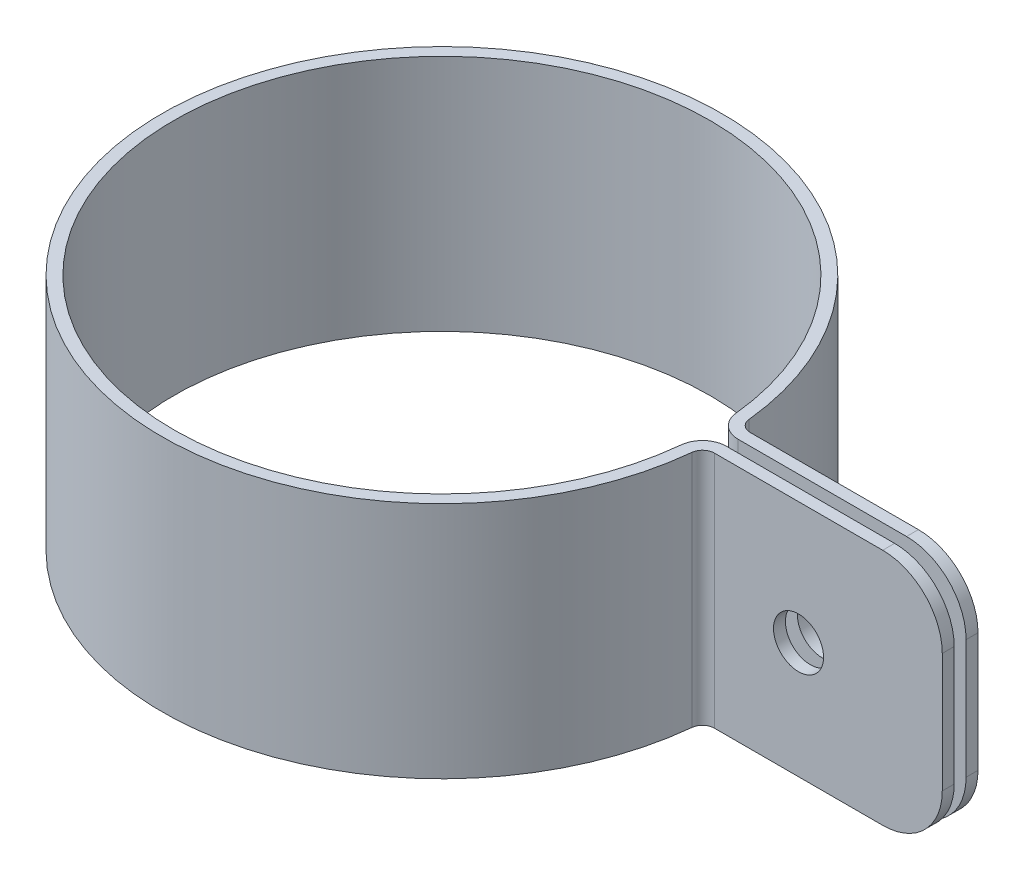
ISO-10303-21;
HEADER;
FILE_DESCRIPTION(('STEP AP214'),'2;1');
FILE_NAME('part.step','',(''),(''),'','','');
FILE_SCHEMA(('AUTOMOTIVE_DESIGN { 1 0 10303 214 1 1 1 1 }'));
ENDSEC;
DATA;
#1=APPLICATION_CONTEXT('core data for automotive mechanical design processes');
#2=APPLICATION_PROTOCOL_DEFINITION('international standard','automotive_design',2000,#1);
#3=PRODUCT_CONTEXT('',#1,'mechanical');
#4=PRODUCT('Part','Part','',(#3));
#5=PRODUCT_RELATED_PRODUCT_CATEGORY('part','',(#4));
#6=PRODUCT_DEFINITION_FORMATION('','',#4);
#7=PRODUCT_DEFINITION_CONTEXT('part definition',#1,'design');
#8=PRODUCT_DEFINITION('design','',#6,#7);
#9=PRODUCT_DEFINITION_SHAPE('','',#8);
#10=(LENGTH_UNIT() NAMED_UNIT(*) SI_UNIT(.MILLI.,.METRE.));
#11=(NAMED_UNIT(*) PLANE_ANGLE_UNIT() SI_UNIT($,.RADIAN.));
#12=(NAMED_UNIT(*) SI_UNIT($,.STERADIAN.) SOLID_ANGLE_UNIT());
#13=UNCERTAINTY_MEASURE_WITH_UNIT(LENGTH_MEASURE(1.E-05),#10,'distance_accuracy_value','');
#14=(GEOMETRIC_REPRESENTATION_CONTEXT(3) GLOBAL_UNCERTAINTY_ASSIGNED_CONTEXT((#13)) GLOBAL_UNIT_ASSIGNED_CONTEXT((#10,
#11,#12)) REPRESENTATION_CONTEXT('',''));
#15=CARTESIAN_POINT('',(0.,0.,0.));
#16=DIRECTION('',(0.,0.,1.));
#17=DIRECTION('',(1.,0.,0.));
#18=AXIS2_PLACEMENT_3D('',#15,#16,#17);
#19=CARTESIAN_POINT('',(43.5,20.,-0.5));
#20=DIRECTION('',(-1.,0.,0.));
#21=DIRECTION('',(0.,0.,1.));
#22=AXIS2_PLACEMENT_3D('',#19,#20,#21);
#23=PLANE('',#22);
#24=DIRECTION('',(0.,-1.,0.));
#25=VECTOR('',#24,1.);
#26=CARTESIAN_POINT('',(43.5,20.,-0.5));
#27=LINE('',#26,#25);
#28=CARTESIAN_POINT('',(43.5,15.,-0.5));
#29=VERTEX_POINT('',#28);
#30=CARTESIAN_POINT('',(43.5,5.,-0.5));
#31=VERTEX_POINT('',#30);
#32=EDGE_CURVE('E189',#29,#31,#27,.T.);
#33=ORIENTED_EDGE('',*,*,#32,.T.);
#34=DIRECTION('',(0.,0.,-1.));
#35=VECTOR('',#34,1.);
#36=CARTESIAN_POINT('',(43.5,5.,-0.5));
#37=LINE('',#36,#35);
#38=CARTESIAN_POINT('',(43.5,5.,-1.5));
#39=VERTEX_POINT('',#38);
#40=EDGE_CURVE('E234',#31,#39,#37,.T.);
#41=ORIENTED_EDGE('',*,*,#40,.T.);
#42=DIRECTION('',(0.,-1.,0.));
#43=VECTOR('',#42,1.);
#44=CARTESIAN_POINT('',(43.5,20.,-1.5));
#45=LINE('',#44,#43);
#46=CARTESIAN_POINT('',(43.5,15.,-1.5));
#47=VERTEX_POINT('',#46);
#48=EDGE_CURVE('E174',#47,#39,#45,.T.);
#49=ORIENTED_EDGE('',*,*,#48,.F.);
#50=DIRECTION('',(0.,0.,-1.));
#51=VECTOR('',#50,1.);
#52=CARTESIAN_POINT('',(43.5,15.,-0.5));
#53=LINE('',#52,#51);
#54=EDGE_CURVE('E232',#47,#29,#53,.F.);
#55=ORIENTED_EDGE('',*,*,#54,.T.);
#56=EDGE_LOOP('',(#33,#41,#49,#55));
#57=FACE_BOUND('',#56,.T.);
#58=ADVANCED_FACE('F36',(#57),#23,.F.);
#59=CARTESIAN_POINT('',(43.5,20.,-1.5));
#60=DIRECTION('',(0.,0.,1.));
#61=DIRECTION('',(1.,0.,0.));
#62=AXIS2_PLACEMENT_3D('',#59,#60,#61);
#63=PLANE('',#62);
#64=CARTESIAN_POINT('',(31.4360576069539,9.73770905349625,-1.5));
#65=DIRECTION('',(0.,0.,-1.));
#66=DIRECTION('',(-1.,0.,0.));
#67=AXIS2_PLACEMENT_3D('',#64,#65,#66);
#68=CIRCLE('',#67,2.09999999999999);
#69=CARTESIAN_POINT('',(29.336057606954,9.73770905349625,-1.5));
#70=VERTEX_POINT('',#69);
#71=EDGE_CURVE('E364',#70,#70,#68,.T.);
#72=ORIENTED_EDGE('',*,*,#71,.F.);
#73=EDGE_LOOP('',(#72));
#74=FACE_BOUND('',#73,.T.);
#75=ORIENTED_EDGE('',*,*,#48,.T.);
#76=CARTESIAN_POINT('',(38.5,5.,-1.5));
#77=DIRECTION('',(0.,0.,1.));
#78=DIRECTION('',(1.,0.,0.));
#79=AXIS2_PLACEMENT_3D('',#76,#77,#78);
#80=CIRCLE('',#79,5.);
#81=CARTESIAN_POINT('',(38.5,0.,-1.5));
#82=VERTEX_POINT('',#81);
#83=EDGE_CURVE('E239',#39,#82,#80,.F.);
#84=ORIENTED_EDGE('',*,*,#83,.T.);
#85=DIRECTION('',(-1.,0.,0.));
#86=VECTOR('',#85,1.);
#87=CARTESIAN_POINT('',(43.5,0.,-1.5));
#88=LINE('',#87,#86);
#89=CARTESIAN_POINT('',(24.3721152139079,0.,-1.5));
#90=VERTEX_POINT('',#89);
#91=EDGE_CURVE('E277',#82,#90,#88,.T.);
#92=ORIENTED_EDGE('',*,*,#91,.T.);
#93=DIRECTION('',(0.,1.,0.));
#94=VECTOR('',#93,1.);
#95=CARTESIAN_POINT('',(24.3721152139079,20.,-1.5));
#96=LINE('',#95,#94);
#97=CARTESIAN_POINT('',(24.3721152139079,20.,-1.5));
#98=VERTEX_POINT('',#97);
#99=EDGE_CURVE('E217',#90,#98,#96,.T.);
#100=ORIENTED_EDGE('',*,*,#99,.T.);
#101=DIRECTION('',(-1.,0.,0.));
#102=VECTOR('',#101,1.);
#103=CARTESIAN_POINT('',(43.5,20.,-1.5));
#104=LINE('',#103,#102);
#105=CARTESIAN_POINT('',(38.5,20.,-1.5));
#106=VERTEX_POINT('',#105);
#107=EDGE_CURVE('E180',#106,#98,#104,.T.);
#108=ORIENTED_EDGE('',*,*,#107,.F.);
#109=CARTESIAN_POINT('',(38.5,15.,-1.5));
#110=DIRECTION('',(0.,0.,1.));
#111=DIRECTION('',(1.,0.,0.));
#112=AXIS2_PLACEMENT_3D('',#109,#110,#111);
#113=CIRCLE('',#112,5.);
#114=EDGE_CURVE('E237',#106,#47,#113,.F.);
#115=ORIENTED_EDGE('',*,*,#114,.T.);
#116=EDGE_LOOP('',(#75,#84,#92,#100,#108,#115));
#117=FACE_BOUND('',#116,.T.);
#118=ADVANCED_FACE('F305',(#74,#117),#63,.F.);
#119=CARTESIAN_POINT('',(0.,20.,0.));
#120=DIRECTION('',(0.,-1.,0.));
#121=DIRECTION('',(0.,0.,-1.));
#122=AXIS2_PLACEMENT_3D('',#119,#120,#121);
#123=CYLINDRICAL_SURFACE('',#122,23.5);
#124=CARTESIAN_POINT('',(0.,20.,0.));
#125=DIRECTION('',(0.,1.,0.));
#126=DIRECTION('',(0.,0.,1.));
#127=AXIS2_PLACEMENT_3D('',#124,#125,#126);
#128=CIRCLE('',#127,23.5);
#129=CARTESIAN_POINT('',(23.3773350010953,20.,-2.39795918367347));
#130=VERTEX_POINT('',#129);
#131=CARTESIAN_POINT('',(23.3773350010953,20.,2.39795918367347));
#132=VERTEX_POINT('',#131);
#133=EDGE_CURVE('E183',#130,#132,#128,.T.);
#134=ORIENTED_EDGE('',*,*,#133,.F.);
#135=DIRECTION('',(0.,-1.,0.));
#136=VECTOR('',#135,1.);
#137=CARTESIAN_POINT('',(23.3773350010953,20.,-2.39795918367347));
#138=LINE('',#137,#136);
#139=CARTESIAN_POINT('',(23.3773350010953,0.,-2.39795918367347));
#140=VERTEX_POINT('',#139);
#141=EDGE_CURVE('E214',#130,#140,#138,.T.);
#142=ORIENTED_EDGE('',*,*,#141,.T.);
#143=CARTESIAN_POINT('',(0.,0.,0.));
#144=DIRECTION('',(0.,1.,0.));
#145=DIRECTION('',(0.,0.,1.));
#146=AXIS2_PLACEMENT_3D('',#143,#144,#145);
#147=CIRCLE('',#146,23.5);
#148=CARTESIAN_POINT('',(23.3773350010953,0.,2.39795918367347));
#149=VERTEX_POINT('',#148);
#150=EDGE_CURVE('E279',#140,#149,#147,.T.);
#151=ORIENTED_EDGE('',*,*,#150,.T.);
#152=DIRECTION('',(0.,-1.,0.));
#153=VECTOR('',#152,1.);
#154=CARTESIAN_POINT('',(23.3773350010953,20.,2.39795918367347));
#155=LINE('',#154,#153);
#156=EDGE_CURVE('E212',#149,#132,#155,.F.);
#157=ORIENTED_EDGE('',*,*,#156,.T.);
#158=EDGE_LOOP('',(#134,#142,#151,#157));
#159=FACE_BOUND('',#158,.T.);
#160=ADVANCED_FACE('F311',(#159),#123,.T.);
#161=CARTESIAN_POINT('',(43.5,20.,1.5));
#162=DIRECTION('',(0.,0.,-1.));
#163=DIRECTION('',(-1.,0.,0.));
#164=AXIS2_PLACEMENT_3D('',#161,#162,#163);
#165=PLANE('',#164);
#166=CARTESIAN_POINT('',(31.4360576069539,9.73770905349625,1.5));
#167=DIRECTION('',(0.,0.,-1.));
#168=DIRECTION('',(-1.,0.,0.));
#169=AXIS2_PLACEMENT_3D('',#166,#167,#168);
#170=CIRCLE('',#169,2.09999999999999);
#171=CARTESIAN_POINT('',(29.336057606954,9.73770905349625,1.5));
#172=VERTEX_POINT('',#171);
#173=EDGE_CURVE('E280',#172,#172,#170,.T.);
#174=ORIENTED_EDGE('',*,*,#173,.T.);
#175=EDGE_LOOP('',(#174));
#176=FACE_BOUND('',#175,.T.);
#177=DIRECTION('',(1.,0.,0.));
#178=VECTOR('',#177,1.);
#179=CARTESIAN_POINT('',(43.5,0.,1.5));
#180=LINE('',#179,#178);
#181=CARTESIAN_POINT('',(24.3721152139079,0.,1.5));
#182=VERTEX_POINT('',#181);
#183=CARTESIAN_POINT('',(38.5,0.,1.5));
#184=VERTEX_POINT('',#183);
#185=EDGE_CURVE('E283',#182,#184,#180,.T.);
#186=ORIENTED_EDGE('',*,*,#185,.T.);
#187=CARTESIAN_POINT('',(38.5,5.,1.5));
#188=DIRECTION('',(0.,0.,-1.));
#189=DIRECTION('',(-1.,0.,0.));
#190=AXIS2_PLACEMENT_3D('',#187,#188,#189);
#191=CIRCLE('',#190,5.);
#192=CARTESIAN_POINT('',(43.5,5.,1.5));
#193=VERTEX_POINT('',#192);
#194=EDGE_CURVE('E257',#184,#193,#191,.F.);
#195=ORIENTED_EDGE('',*,*,#194,.T.);
#196=DIRECTION('',(0.,-1.,0.));
#197=VECTOR('',#196,1.);
#198=CARTESIAN_POINT('',(43.5,20.,1.5));
#199=LINE('',#198,#197);
#200=CARTESIAN_POINT('',(43.5,15.,1.5));
#201=VERTEX_POINT('',#200);
#202=EDGE_CURVE('E195',#201,#193,#199,.T.);
#203=ORIENTED_EDGE('',*,*,#202,.F.);
#204=CARTESIAN_POINT('',(38.5,15.,1.5));
#205=DIRECTION('',(0.,0.,-1.));
#206=DIRECTION('',(-1.,0.,0.));
#207=AXIS2_PLACEMENT_3D('',#204,#205,#206);
#208=CIRCLE('',#207,5.);
#209=CARTESIAN_POINT('',(38.5,20.,1.5));
#210=VERTEX_POINT('',#209);
#211=EDGE_CURVE('E52',#201,#210,#208,.F.);
#212=ORIENTED_EDGE('',*,*,#211,.T.);
#213=DIRECTION('',(1.,0.,0.));
#214=VECTOR('',#213,1.);
#215=CARTESIAN_POINT('',(43.5,20.,1.5));
#216=LINE('',#215,#214);
#217=CARTESIAN_POINT('',(24.3721152139079,20.,1.5));
#218=VERTEX_POINT('',#217);
#219=EDGE_CURVE('E263',#218,#210,#216,.T.);
#220=ORIENTED_EDGE('',*,*,#219,.F.);
#221=DIRECTION('',(0.,1.,0.));
#222=VECTOR('',#221,1.);
#223=CARTESIAN_POINT('',(24.3721152139079,0.,1.5));
#224=LINE('',#223,#222);
#225=EDGE_CURVE('E220',#218,#182,#224,.F.);
#226=ORIENTED_EDGE('',*,*,#225,.T.);
#227=EDGE_LOOP('',(#186,#195,#203,#212,#220,#226));
#228=FACE_BOUND('',#227,.T.);
#229=ADVANCED_FACE('F436',(#176,#228),#165,.F.);
#230=CARTESIAN_POINT('',(43.5,20.,1.5));
#231=DIRECTION('',(-1.,0.,0.));
#232=DIRECTION('',(0.,0.,1.));
#233=AXIS2_PLACEMENT_3D('',#230,#231,#232);
#234=PLANE('',#233);
#235=ORIENTED_EDGE('',*,*,#202,.T.);
#236=DIRECTION('',(0.,0.,-1.));
#237=VECTOR('',#236,1.);
#238=CARTESIAN_POINT('',(43.5,5.,1.5));
#239=LINE('',#238,#237);
#240=CARTESIAN_POINT('',(43.5,5.,0.5));
#241=VERTEX_POINT('',#240);
#242=EDGE_CURVE('E250',#193,#241,#239,.T.);
#243=ORIENTED_EDGE('',*,*,#242,.T.);
#244=DIRECTION('',(0.,-1.,0.));
#245=VECTOR('',#244,1.);
#246=CARTESIAN_POINT('',(43.5,20.,0.5));
#247=LINE('',#246,#245);
#248=CARTESIAN_POINT('',(43.5,15.,0.5));
#249=VERTEX_POINT('',#248);
#250=EDGE_CURVE('E192',#249,#241,#247,.T.);
#251=ORIENTED_EDGE('',*,*,#250,.F.);
#252=DIRECTION('',(0.,0.,-1.));
#253=VECTOR('',#252,1.);
#254=CARTESIAN_POINT('',(43.5,15.,1.5));
#255=LINE('',#254,#253);
#256=EDGE_CURVE('E248',#249,#201,#255,.F.);
#257=ORIENTED_EDGE('',*,*,#256,.T.);
#258=EDGE_LOOP('',(#235,#243,#251,#257));
#259=FACE_BOUND('',#258,.T.);
#260=ADVANCED_FACE('F301',(#259),#234,.F.);
#261=CARTESIAN_POINT('',(43.5,20.,0.5));
#262=DIRECTION('',(0.,0.,1.));
#263=DIRECTION('',(1.,0.,0.));
#264=AXIS2_PLACEMENT_3D('',#261,#262,#263);
#265=PLANE('',#264);
#266=CARTESIAN_POINT('',(31.4360576069539,9.73770905349625,0.5));
#267=DIRECTION('',(0.,0.,1.));
#268=DIRECTION('',(1.,0.,0.));
#269=AXIS2_PLACEMENT_3D('',#266,#267,#268);
#270=CIRCLE('',#269,2.09999999999999);
#271=CARTESIAN_POINT('',(33.5360576069539,9.73770905349625,0.5));
#272=VERTEX_POINT('',#271);
#273=EDGE_CURVE('E361',#272,#272,#270,.T.);
#274=ORIENTED_EDGE('',*,*,#273,.T.);
#275=EDGE_LOOP('',(#274));
#276=FACE_BOUND('',#275,.T.);
#277=ORIENTED_EDGE('',*,*,#250,.T.);
#278=CARTESIAN_POINT('',(38.5,5.,0.5));
#279=DIRECTION('',(0.,0.,1.));
#280=DIRECTION('',(1.,0.,0.));
#281=AXIS2_PLACEMENT_3D('',#278,#279,#280);
#282=CIRCLE('',#281,5.);
#283=CARTESIAN_POINT('',(38.5,0.,0.5));
#284=VERTEX_POINT('',#283);
#285=EDGE_CURVE('E254',#241,#284,#282,.F.);
#286=ORIENTED_EDGE('',*,*,#285,.T.);
#287=DIRECTION('',(-1.,0.,0.));
#288=VECTOR('',#287,1.);
#289=CARTESIAN_POINT('',(43.5,0.,0.5));
#290=LINE('',#289,#288);
#291=CARTESIAN_POINT('',(24.3721152139079,0.,0.5));
#292=VERTEX_POINT('',#291);
#293=EDGE_CURVE('E185',#284,#292,#290,.T.);
#294=ORIENTED_EDGE('',*,*,#293,.T.);
#295=DIRECTION('',(0.,-1.,0.));
#296=VECTOR('',#295,1.);
#297=CARTESIAN_POINT('',(24.3721152139079,20.,0.5));
#298=LINE('',#297,#296);
#299=CARTESIAN_POINT('',(24.3721152139079,20.,0.5));
#300=VERTEX_POINT('',#299);
#301=EDGE_CURVE('E209',#292,#300,#298,.F.);
#302=ORIENTED_EDGE('',*,*,#301,.T.);
#303=DIRECTION('',(-1.,0.,0.));
#304=VECTOR('',#303,1.);
#305=CARTESIAN_POINT('',(43.5,20.,0.5));
#306=LINE('',#305,#304);
#307=CARTESIAN_POINT('',(38.5,20.,0.5));
#308=VERTEX_POINT('',#307);
#309=EDGE_CURVE('E262',#308,#300,#306,.T.);
#310=ORIENTED_EDGE('',*,*,#309,.F.);
#311=CARTESIAN_POINT('',(38.5,15.,0.5));
#312=DIRECTION('',(0.,0.,1.));
#313=DIRECTION('',(1.,0.,0.));
#314=AXIS2_PLACEMENT_3D('',#311,#312,#313);
#315=CIRCLE('',#314,5.);
#316=EDGE_CURVE('E60',#308,#249,#315,.F.);
#317=ORIENTED_EDGE('',*,*,#316,.T.);
#318=EDGE_LOOP('',(#277,#286,#294,#302,#310,#317));
#319=FACE_BOUND('',#318,.T.);
#320=ADVANCED_FACE('F265',(#276,#319),#265,.F.);
#321=CARTESIAN_POINT('',(0.,20.,0.));
#322=DIRECTION('',(0.,-1.,0.));
#323=DIRECTION('',(0.,0.,-1.));
#324=AXIS2_PLACEMENT_3D('',#321,#322,#323);
#325=CYLINDRICAL_SURFACE('',#324,22.5);
#326=CARTESIAN_POINT('',(0.,0.,0.));
#327=DIRECTION('',(0.,-1.,0.));
#328=DIRECTION('',(0.,0.,1.));
#329=AXIS2_PLACEMENT_3D('',#326,#327,#328);
#330=CIRCLE('',#329,22.5);
#331=CARTESIAN_POINT('',(22.3825547882827,0.,2.29591836734694));
#332=VERTEX_POINT('',#331);
#333=CARTESIAN_POINT('',(22.3825547882827,0.,-2.29591836734694));
#334=VERTEX_POINT('',#333);
#335=EDGE_CURVE('E181',#332,#334,#330,.T.);
#336=ORIENTED_EDGE('',*,*,#335,.T.);
#337=DIRECTION('',(0.,-1.,0.));
#338=VECTOR('',#337,1.);
#339=CARTESIAN_POINT('',(22.3825547882827,20.,-2.29591836734694));
#340=LINE('',#339,#338);
#341=CARTESIAN_POINT('',(22.3825547882827,20.,-2.29591836734694));
#342=VERTEX_POINT('',#341);
#343=EDGE_CURVE('E158',#334,#342,#340,.F.);
#344=ORIENTED_EDGE('',*,*,#343,.T.);
#345=CARTESIAN_POINT('',(0.,20.,0.));
#346=DIRECTION('',(0.,-1.,0.));
#347=DIRECTION('',(0.,0.,1.));
#348=AXIS2_PLACEMENT_3D('',#345,#346,#347);
#349=CIRCLE('',#348,22.5);
#350=CARTESIAN_POINT('',(22.3825547882827,20.,2.29591836734694));
#351=VERTEX_POINT('',#350);
#352=EDGE_CURVE('E269',#351,#342,#349,.T.);
#353=ORIENTED_EDGE('',*,*,#352,.F.);
#354=DIRECTION('',(0.,-1.,0.));
#355=VECTOR('',#354,1.);
#356=CARTESIAN_POINT('',(22.3825547882827,20.,2.29591836734694));
#357=LINE('',#356,#355);
#358=EDGE_CURVE('E163',#351,#332,#357,.T.);
#359=ORIENTED_EDGE('',*,*,#358,.T.);
#360=EDGE_LOOP('',(#336,#344,#353,#359));
#361=FACE_BOUND('',#360,.T.);
#362=ADVANCED_FACE('F292',(#361),#325,.F.);
#363=CARTESIAN_POINT('',(43.5,20.,-0.5));
#364=DIRECTION('',(0.,0.,-1.));
#365=DIRECTION('',(-1.,0.,0.));
#366=AXIS2_PLACEMENT_3D('',#363,#364,#365);
#367=PLANE('',#366);
#368=CARTESIAN_POINT('',(31.4360576069539,9.73770905349625,-0.5));
#369=DIRECTION('',(0.,0.,-1.));
#370=DIRECTION('',(-1.,0.,0.));
#371=AXIS2_PLACEMENT_3D('',#368,#369,#370);
#372=CIRCLE('',#371,2.09999999999999);
#373=CARTESIAN_POINT('',(29.336057606954,9.73770905349625,-0.5));
#374=VERTEX_POINT('',#373);
#375=EDGE_CURVE('E40',#374,#374,#372,.T.);
#376=ORIENTED_EDGE('',*,*,#375,.T.);
#377=EDGE_LOOP('',(#376));
#378=FACE_BOUND('',#377,.T.);
#379=DIRECTION('',(1.,0.,0.));
#380=VECTOR('',#379,1.);
#381=CARTESIAN_POINT('',(43.5,0.,-0.5));
#382=LINE('',#381,#380);
#383=CARTESIAN_POINT('',(24.3721152139079,0.,-0.5));
#384=VERTEX_POINT('',#383);
#385=CARTESIAN_POINT('',(38.5,0.,-0.5));
#386=VERTEX_POINT('',#385);
#387=EDGE_CURVE('E170',#384,#386,#382,.T.);
#388=ORIENTED_EDGE('',*,*,#387,.T.);
#389=CARTESIAN_POINT('',(38.5,5.,-0.5));
#390=DIRECTION('',(0.,0.,-1.));
#391=DIRECTION('',(-1.,0.,0.));
#392=AXIS2_PLACEMENT_3D('',#389,#390,#391);
#393=CIRCLE('',#392,5.);
#394=EDGE_CURVE('E246',#386,#31,#393,.F.);
#395=ORIENTED_EDGE('',*,*,#394,.T.);
#396=ORIENTED_EDGE('',*,*,#32,.F.);
#397=CARTESIAN_POINT('',(38.5,15.,-0.5));
#398=DIRECTION('',(0.,0.,-1.));
#399=DIRECTION('',(-1.,0.,0.));
#400=AXIS2_PLACEMENT_3D('',#397,#398,#399);
#401=CIRCLE('',#400,5.);
#402=CARTESIAN_POINT('',(38.5,20.,-0.5));
#403=VERTEX_POINT('',#402);
#404=EDGE_CURVE('E244',#29,#403,#401,.F.);
#405=ORIENTED_EDGE('',*,*,#404,.T.);
#406=DIRECTION('',(1.,0.,0.));
#407=VECTOR('',#406,1.);
#408=CARTESIAN_POINT('',(43.5,20.,-0.5));
#409=LINE('',#408,#407);
#410=CARTESIAN_POINT('',(24.3721152139079,20.,-0.5));
#411=VERTEX_POINT('',#410);
#412=EDGE_CURVE('E173',#411,#403,#409,.T.);
#413=ORIENTED_EDGE('',*,*,#412,.F.);
#414=DIRECTION('',(0.,-1.,0.));
#415=VECTOR('',#414,1.);
#416=CARTESIAN_POINT('',(24.3721152139079,20.,-0.5));
#417=LINE('',#416,#415);
#418=EDGE_CURVE('E157',#411,#384,#417,.T.);
#419=ORIENTED_EDGE('',*,*,#418,.T.);
#420=EDGE_LOOP('',(#388,#395,#396,#405,#413,#419));
#421=FACE_BOUND('',#420,.T.);
#422=ADVANCED_FACE('F169',(#378,#421),#367,.F.);
#423=CARTESIAN_POINT('',(0.,20.,0.));
#424=DIRECTION('',(0.,1.,0.));
#425=DIRECTION('',(0.,0.,1.));
#426=AXIS2_PLACEMENT_3D('',#423,#424,#425);
#427=PLANE('',#426);
#428=ORIENTED_EDGE('',*,*,#412,.T.);
#429=DIRECTION('',(0.,0.,-1.));
#430=VECTOR('',#429,1.);
#431=CARTESIAN_POINT('',(38.5,20.,-1.5));
#432=LINE('',#431,#430);
#433=EDGE_CURVE('E11',#403,#106,#432,.T.);
#434=ORIENTED_EDGE('',*,*,#433,.T.);
#435=ORIENTED_EDGE('',*,*,#107,.T.);
#436=CARTESIAN_POINT('',(24.3721152139079,20.,-2.5));
#437=DIRECTION('',(0.,1.,0.));
#438=DIRECTION('',(0.,0.,1.));
#439=AXIS2_PLACEMENT_3D('',#436,#437,#438);
#440=CIRCLE('',#439,1.);
#441=EDGE_CURVE('E226',#98,#130,#440,.F.);
#442=ORIENTED_EDGE('',*,*,#441,.T.);
#443=ORIENTED_EDGE('',*,*,#133,.T.);
#444=CARTESIAN_POINT('',(24.3721152139079,20.,2.5));
#445=DIRECTION('',(0.,1.,0.));
#446=DIRECTION('',(0.,0.,1.));
#447=AXIS2_PLACEMENT_3D('',#444,#445,#446);
#448=CIRCLE('',#447,1.);
#449=EDGE_CURVE('E230',#132,#218,#448,.F.);
#450=ORIENTED_EDGE('',*,*,#449,.T.);
#451=ORIENTED_EDGE('',*,*,#219,.T.);
#452=DIRECTION('',(0.,0.,-1.));
#453=VECTOR('',#452,1.);
#454=CARTESIAN_POINT('',(38.5,20.,0.5));
#455=LINE('',#454,#453);
#456=EDGE_CURVE('E45',#210,#308,#455,.T.);
#457=ORIENTED_EDGE('',*,*,#456,.T.);
#458=ORIENTED_EDGE('',*,*,#309,.T.);
#459=CARTESIAN_POINT('',(24.3721152139079,20.,2.5));
#460=DIRECTION('',(0.,1.,0.));
#461=DIRECTION('',(0.,0.,1.));
#462=AXIS2_PLACEMENT_3D('',#459,#460,#461);
#463=CIRCLE('',#462,2.);
#464=EDGE_CURVE('E205',#300,#351,#463,.T.);
#465=ORIENTED_EDGE('',*,*,#464,.T.);
#466=ORIENTED_EDGE('',*,*,#352,.T.);
#467=CARTESIAN_POINT('',(24.3721152139079,20.,-2.5));
#468=DIRECTION('',(0.,1.,0.));
#469=DIRECTION('',(0.,0.,1.));
#470=AXIS2_PLACEMENT_3D('',#467,#468,#469);
#471=CIRCLE('',#470,2.);
#472=EDGE_CURVE('E207',#342,#411,#471,.T.);
#473=ORIENTED_EDGE('',*,*,#472,.T.);
#474=EDGE_LOOP('',(#428,#434,#435,#442,#443,#450,#451,#457,#458,#465,#466,#473));
#475=FACE_BOUND('',#474,.T.);
#476=ADVANCED_FACE('F261',(#475),#427,.T.);
#477=CARTESIAN_POINT('',(0.,0.,0.));
#478=DIRECTION('',(0.,1.,0.));
#479=DIRECTION('',(0.,0.,1.));
#480=AXIS2_PLACEMENT_3D('',#477,#478,#479);
#481=PLANE('',#480);
#482=ORIENTED_EDGE('',*,*,#91,.F.);
#483=DIRECTION('',(0.,0.,-1.));
#484=VECTOR('',#483,1.);
#485=CARTESIAN_POINT('',(38.5,0.,0.));
#486=LINE('',#485,#484);
#487=EDGE_CURVE('E179',#82,#386,#486,.F.);
#488=ORIENTED_EDGE('',*,*,#487,.T.);
#489=ORIENTED_EDGE('',*,*,#387,.F.);
#490=CARTESIAN_POINT('',(24.3721152139079,0.,-2.5));
#491=DIRECTION('',(0.,1.,0.));
#492=DIRECTION('',(0.,0.,1.));
#493=AXIS2_PLACEMENT_3D('',#490,#491,#492);
#494=CIRCLE('',#493,2.);
#495=EDGE_CURVE('E153',#384,#334,#494,.F.);
#496=ORIENTED_EDGE('',*,*,#495,.T.);
#497=ORIENTED_EDGE('',*,*,#335,.F.);
#498=CARTESIAN_POINT('',(24.3721152139079,0.,2.5));
#499=DIRECTION('',(0.,1.,0.));
#500=DIRECTION('',(0.,0.,1.));
#501=AXIS2_PLACEMENT_3D('',#498,#499,#500);
#502=CIRCLE('',#501,2.);
#503=EDGE_CURVE('E164',#332,#292,#502,.F.);
#504=ORIENTED_EDGE('',*,*,#503,.T.);
#505=ORIENTED_EDGE('',*,*,#293,.F.);
#506=DIRECTION('',(0.,0.,-1.));
#507=VECTOR('',#506,1.);
#508=CARTESIAN_POINT('',(38.5,0.,0.));
#509=LINE('',#508,#507);
#510=EDGE_CURVE('E241',#284,#184,#509,.F.);
#511=ORIENTED_EDGE('',*,*,#510,.T.);
#512=ORIENTED_EDGE('',*,*,#185,.F.);
#513=CARTESIAN_POINT('',(24.3721152139079,0.,2.5));
#514=DIRECTION('',(0.,1.,0.));
#515=DIRECTION('',(0.,0.,1.));
#516=AXIS2_PLACEMENT_3D('',#513,#514,#515);
#517=CIRCLE('',#516,1.);
#518=EDGE_CURVE('E228',#182,#149,#517,.T.);
#519=ORIENTED_EDGE('',*,*,#518,.T.);
#520=ORIENTED_EDGE('',*,*,#150,.F.);
#521=CARTESIAN_POINT('',(24.3721152139079,0.,-2.5));
#522=DIRECTION('',(0.,1.,0.));
#523=DIRECTION('',(0.,0.,1.));
#524=AXIS2_PLACEMENT_3D('',#521,#522,#523);
#525=CIRCLE('',#524,1.);
#526=EDGE_CURVE('E223',#140,#90,#525,.T.);
#527=ORIENTED_EDGE('',*,*,#526,.T.);
#528=EDGE_LOOP('',(#482,#488,#489,#496,#497,#504,#505,#511,#512,#519,#520,#527));
#529=FACE_BOUND('',#528,.T.);
#530=ADVANCED_FACE('F177',(#529),#481,.F.);
#531=CARTESIAN_POINT('',(24.3721152139079,20.,-2.5));
#532=DIRECTION('',(0.,-1.,0.));
#533=DIRECTION('',(0.,0.,-1.));
#534=AXIS2_PLACEMENT_3D('',#531,#532,#533);
#535=CYLINDRICAL_SURFACE('',#534,2.);
#536=ORIENTED_EDGE('',*,*,#472,.F.);
#537=ORIENTED_EDGE('',*,*,#343,.F.);
#538=ORIENTED_EDGE('',*,*,#495,.F.);
#539=ORIENTED_EDGE('',*,*,#418,.F.);
#540=EDGE_LOOP('',(#536,#537,#538,#539));
#541=FACE_BOUND('',#540,.T.);
#542=ADVANCED_FACE('F156',(#541),#535,.T.);
#543=CARTESIAN_POINT('',(24.3721152139079,20.,2.5));
#544=DIRECTION('',(0.,-1.,0.));
#545=DIRECTION('',(0.,0.,-1.));
#546=AXIS2_PLACEMENT_3D('',#543,#544,#545);
#547=CYLINDRICAL_SURFACE('',#546,2.);
#548=ORIENTED_EDGE('',*,*,#464,.F.);
#549=ORIENTED_EDGE('',*,*,#301,.F.);
#550=ORIENTED_EDGE('',*,*,#503,.F.);
#551=ORIENTED_EDGE('',*,*,#358,.F.);
#552=EDGE_LOOP('',(#548,#549,#550,#551));
#553=FACE_BOUND('',#552,.T.);
#554=ADVANCED_FACE('F289',(#553),#547,.T.);
#555=CARTESIAN_POINT('',(24.3721152139079,20.,-2.5));
#556=DIRECTION('',(0.,-1.,0.));
#557=DIRECTION('',(0.,0.,-1.));
#558=AXIS2_PLACEMENT_3D('',#555,#556,#557);
#559=CYLINDRICAL_SURFACE('',#558,1.);
#560=ORIENTED_EDGE('',*,*,#441,.F.);
#561=ORIENTED_EDGE('',*,*,#99,.F.);
#562=ORIENTED_EDGE('',*,*,#526,.F.);
#563=ORIENTED_EDGE('',*,*,#141,.F.);
#564=EDGE_LOOP('',(#560,#561,#562,#563));
#565=FACE_BOUND('',#564,.T.);
#566=ADVANCED_FACE('F320',(#565),#559,.F.);
#567=CARTESIAN_POINT('',(24.3721152139079,20.,2.5));
#568=DIRECTION('',(0.,-1.,0.));
#569=DIRECTION('',(0.,0.,-1.));
#570=AXIS2_PLACEMENT_3D('',#567,#568,#569);
#571=CYLINDRICAL_SURFACE('',#570,1.);
#572=ORIENTED_EDGE('',*,*,#449,.F.);
#573=ORIENTED_EDGE('',*,*,#156,.F.);
#574=ORIENTED_EDGE('',*,*,#518,.F.);
#575=ORIENTED_EDGE('',*,*,#225,.F.);
#576=EDGE_LOOP('',(#572,#573,#574,#575));
#577=FACE_BOUND('',#576,.T.);
#578=ADVANCED_FACE('F323',(#577),#571,.F.);
#579=CARTESIAN_POINT('',(38.5,5.,-0.5));
#580=DIRECTION('',(0.,0.,-1.));
#581=DIRECTION('',(-1.,0.,0.));
#582=AXIS2_PLACEMENT_3D('',#579,#580,#581);
#583=CYLINDRICAL_SURFACE('',#582,5.);
#584=ORIENTED_EDGE('',*,*,#394,.F.);
#585=ORIENTED_EDGE('',*,*,#487,.F.);
#586=ORIENTED_EDGE('',*,*,#83,.F.);
#587=ORIENTED_EDGE('',*,*,#40,.F.);
#588=EDGE_LOOP('',(#584,#585,#586,#587));
#589=FACE_BOUND('',#588,.T.);
#590=ADVANCED_FACE('F327',(#589),#583,.T.);
#591=CARTESIAN_POINT('',(38.5,5.,1.5));
#592=DIRECTION('',(0.,0.,-1.));
#593=DIRECTION('',(-1.,0.,0.));
#594=AXIS2_PLACEMENT_3D('',#591,#592,#593);
#595=CYLINDRICAL_SURFACE('',#594,5.);
#596=ORIENTED_EDGE('',*,*,#194,.F.);
#597=ORIENTED_EDGE('',*,*,#510,.F.);
#598=ORIENTED_EDGE('',*,*,#285,.F.);
#599=ORIENTED_EDGE('',*,*,#242,.F.);
#600=EDGE_LOOP('',(#596,#597,#598,#599));
#601=FACE_BOUND('',#600,.T.);
#602=ADVANCED_FACE('F331',(#601),#595,.T.);
#603=CARTESIAN_POINT('',(38.5,15.,0.));
#604=DIRECTION('',(0.,0.,1.));
#605=DIRECTION('',(1.,0.,0.));
#606=AXIS2_PLACEMENT_3D('',#603,#604,#605);
#607=CYLINDRICAL_SURFACE('',#606,5.);
#608=ORIENTED_EDGE('',*,*,#404,.F.);
#609=ORIENTED_EDGE('',*,*,#54,.F.);
#610=ORIENTED_EDGE('',*,*,#114,.F.);
#611=ORIENTED_EDGE('',*,*,#433,.F.);
#612=EDGE_LOOP('',(#608,#609,#610,#611));
#613=FACE_BOUND('',#612,.T.);
#614=ADVANCED_FACE('F334',(#613),#607,.T.);
#615=CARTESIAN_POINT('',(38.5,15.,0.));
#616=DIRECTION('',(0.,0.,1.));
#617=DIRECTION('',(1.,0.,0.));
#618=AXIS2_PLACEMENT_3D('',#615,#616,#617);
#619=CYLINDRICAL_SURFACE('',#618,5.);
#620=ORIENTED_EDGE('',*,*,#211,.F.);
#621=ORIENTED_EDGE('',*,*,#256,.F.);
#622=ORIENTED_EDGE('',*,*,#316,.F.);
#623=ORIENTED_EDGE('',*,*,#456,.F.);
#624=EDGE_LOOP('',(#620,#621,#622,#623));
#625=FACE_BOUND('',#624,.T.);
#626=ADVANCED_FACE('F38',(#625),#619,.T.);
#627=CARTESIAN_POINT('',(31.4360576069539,9.73770905349625,-1.5));
#628=DIRECTION('',(0.,0.,-1.));
#629=DIRECTION('',(-1.,0.,0.));
#630=AXIS2_PLACEMENT_3D('',#627,#628,#629);
#631=CYLINDRICAL_SURFACE('',#630,2.09999999999999);
#632=ORIENTED_EDGE('',*,*,#71,.T.);
#633=EDGE_LOOP('',(#632));
#634=FACE_BOUND('',#633,.T.);
#635=ORIENTED_EDGE('',*,*,#375,.F.);
#636=EDGE_LOOP('',(#635));
#637=FACE_BOUND('',#636,.T.);
#638=ADVANCED_FACE('F341',(#634,#637),#631,.F.);
#639=ORIENTED_EDGE('',*,*,#273,.F.);
#640=EDGE_LOOP('',(#639));
#641=FACE_BOUND('',#640,.T.);
#642=ORIENTED_EDGE('',*,*,#173,.F.);
#643=EDGE_LOOP('',(#642));
#644=FACE_BOUND('',#643,.T.);
#645=ADVANCED_FACE('F372',(#641,#644),#631,.F.);
#646=CLOSED_SHELL('',(#58,#118,#160,#229,#260,#320,#362,#422,#476,#530,#542,#554,#566,#578,#590,
#602,#614,#626,#638,#645));
#647=MANIFOLD_SOLID_BREP('B2',#646);
#648=ADVANCED_BREP_SHAPE_REPRESENTATION('',(#18,#647),#14);
#649=SHAPE_DEFINITION_REPRESENTATION(#9,#648);
ENDSEC;
END-ISO-10303-21;
